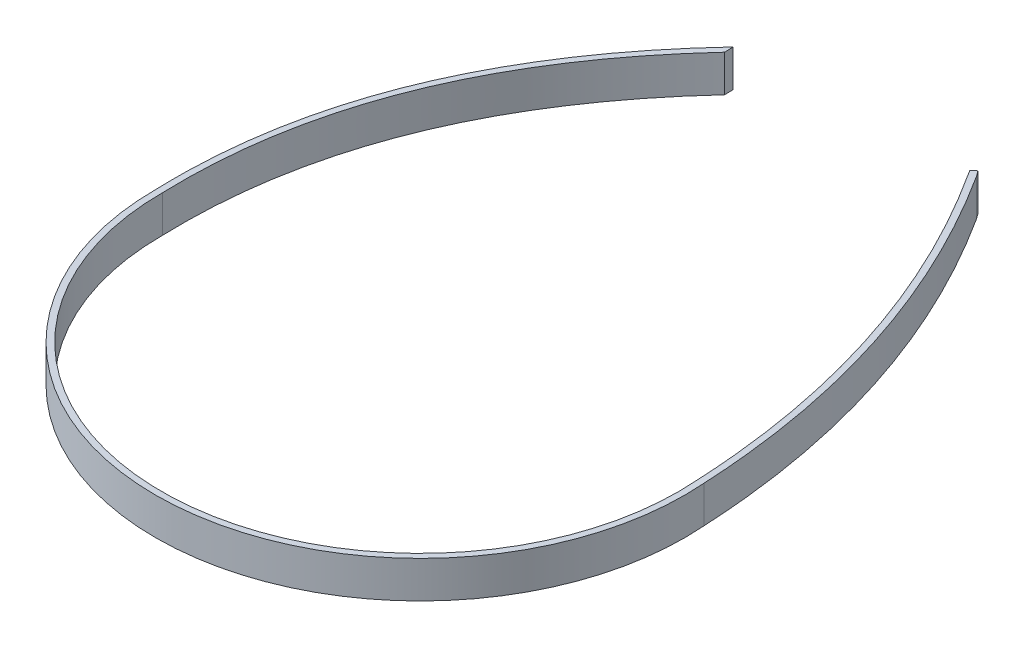
ISO-10303-21;
HEADER;
FILE_DESCRIPTION(('STEP AP214'),'2;1');
FILE_NAME('part.step','',(''),(''),'','','');
FILE_SCHEMA(('AUTOMOTIVE_DESIGN { 1 0 10303 214 1 1 1 1 }'));
ENDSEC;
DATA;
#1=APPLICATION_CONTEXT('core data for automotive mechanical design processes');
#2=APPLICATION_PROTOCOL_DEFINITION('international standard','automotive_design',2000,#1);
#3=PRODUCT_CONTEXT('',#1,'mechanical');
#4=PRODUCT('Part','Part','',(#3));
#5=PRODUCT_RELATED_PRODUCT_CATEGORY('part','',(#4));
#6=PRODUCT_DEFINITION_FORMATION('','',#4);
#7=PRODUCT_DEFINITION_CONTEXT('part definition',#1,'design');
#8=PRODUCT_DEFINITION('design','',#6,#7);
#9=PRODUCT_DEFINITION_SHAPE('','',#8);
#10=(LENGTH_UNIT() NAMED_UNIT(*) SI_UNIT(.MILLI.,.METRE.));
#11=(NAMED_UNIT(*) PLANE_ANGLE_UNIT() SI_UNIT($,.RADIAN.));
#12=(NAMED_UNIT(*) SI_UNIT($,.STERADIAN.) SOLID_ANGLE_UNIT());
#13=UNCERTAINTY_MEASURE_WITH_UNIT(LENGTH_MEASURE(1.E-05),#10,'distance_accuracy_value','');
#14=(GEOMETRIC_REPRESENTATION_CONTEXT(3) GLOBAL_UNCERTAINTY_ASSIGNED_CONTEXT((#13)) GLOBAL_UNIT_ASSIGNED_CONTEXT((#10,
#11,#12)) REPRESENTATION_CONTEXT('',''));
#15=CARTESIAN_POINT('',(0.,0.,0.));
#16=DIRECTION('',(0.,0.,1.));
#17=DIRECTION('',(1.,0.,0.));
#18=AXIS2_PLACEMENT_3D('',#15,#16,#17);
#19=CARTESIAN_POINT('',(-8.07252411648674,1.5,-33.5));
#20=CARTESIAN_POINT('',(-22.1366965566889,1.5,-18.5273338438166));
#21=CARTESIAN_POINT('',(-21.5,1.5,0.));
#22=B_SPLINE_CURVE_WITH_KNOTS('',2,(#19,#20,#21),.UNSPECIFIED.,.F.,.F.,(3,3),(0.,
0.391212050558958),.UNSPECIFIED.);
#23=DIRECTION('',(0.,-1.,0.));
#24=VECTOR('',#23,1.);
#25=SURFACE_OF_LINEAR_EXTRUSION('',#22,#24);
#26=CARTESIAN_POINT('',(-8.07252411648674,-1.5,-33.5));
#27=CARTESIAN_POINT('',(-22.1366965566889,-1.5,-18.5273338438166));
#28=CARTESIAN_POINT('',(-21.5,-1.5,0.));
#29=B_SPLINE_CURVE_WITH_KNOTS('',2,(#26,#27,#28),.UNSPECIFIED.,.F.,.F.,(3,3),(0.,
0.391212050558958),.UNSPECIFIED.);
#30=CARTESIAN_POINT('',(-8.07252411648674,-1.5,-33.5));
#31=VERTEX_POINT('',#30);
#32=CARTESIAN_POINT('',(-21.5,-1.5,0.));
#33=VERTEX_POINT('',#32);
#34=EDGE_CURVE('E203',#31,#33,#29,.T.);
#35=ORIENTED_EDGE('',*,*,#34,.T.);
#36=DIRECTION('',(0.,-1.,0.));
#37=VECTOR('',#36,1.);
#38=CARTESIAN_POINT('',(-21.5,1.5,0.));
#39=LINE('',#38,#37);
#40=CARTESIAN_POINT('',(-21.5,1.5,0.));
#41=VERTEX_POINT('',#40);
#42=EDGE_CURVE('E11',#41,#33,#39,.T.);
#43=ORIENTED_EDGE('',*,*,#42,.F.);
#44=CARTESIAN_POINT('',(-8.07252411648674,1.5,-33.5));
#45=VERTEX_POINT('',#44);
#46=EDGE_CURVE('E241',#45,#41,#22,.T.);
#47=ORIENTED_EDGE('',*,*,#46,.F.);
#48=DIRECTION('',(0.,-1.,0.));
#49=VECTOR('',#48,1.);
#50=CARTESIAN_POINT('',(-8.07252411648674,1.5,-33.5));
#51=LINE('',#50,#49);
#52=EDGE_CURVE('E49',#45,#31,#51,.T.);
#53=ORIENTED_EDGE('',*,*,#52,.T.);
#54=EDGE_LOOP('',(#35,#43,#47,#53));
#55=FACE_BOUND('',#54,.T.);
#56=ADVANCED_FACE('F32',(#55),#25,.F.);
#57=CARTESIAN_POINT('',(0.,1.5,0.));
#58=DIRECTION('',(0.,-1.,0.));
#59=DIRECTION('',(0.,0.,-1.));
#60=AXIS2_PLACEMENT_3D('',#57,#58,#59);
#61=CYLINDRICAL_SURFACE('',#60,21.5);
#62=CARTESIAN_POINT('',(0.,-1.5,0.));
#63=DIRECTION('',(0.,1.,0.));
#64=DIRECTION('',(0.,0.,1.));
#65=AXIS2_PLACEMENT_3D('',#62,#63,#64);
#66=CIRCLE('',#65,21.5);
#67=CARTESIAN_POINT('',(21.4394094780292,-1.5,-1.61298519317216));
#68=VERTEX_POINT('',#67);
#69=EDGE_CURVE('E198',#33,#68,#66,.T.);
#70=ORIENTED_EDGE('',*,*,#69,.T.);
#71=DIRECTION('',(0.,-1.,0.));
#72=VECTOR('',#71,1.);
#73=CARTESIAN_POINT('',(21.4394094780292,1.5,-1.61298519317216));
#74=LINE('',#73,#72);
#75=CARTESIAN_POINT('',(21.4394094780292,1.5,-1.61298519317216));
#76=VERTEX_POINT('',#75);
#77=EDGE_CURVE('E41',#76,#68,#74,.T.);
#78=ORIENTED_EDGE('',*,*,#77,.F.);
#79=CARTESIAN_POINT('',(0.,1.5,0.));
#80=DIRECTION('',(0.,1.,0.));
#81=DIRECTION('',(0.,0.,1.));
#82=AXIS2_PLACEMENT_3D('',#79,#80,#81);
#83=CIRCLE('',#82,21.5);
#84=EDGE_CURVE('E93',#41,#76,#83,.T.);
#85=ORIENTED_EDGE('',*,*,#84,.F.);
#86=ORIENTED_EDGE('',*,*,#42,.T.);
#87=EDGE_LOOP('',(#70,#78,#85,#86));
#88=FACE_BOUND('',#87,.T.);
#89=ADVANCED_FACE('F191',(#88),#61,.T.);
#90=CARTESIAN_POINT('',(10.9274758835133,1.5,-34.2657916261625));
#91=CARTESIAN_POINT('',(20.5757565718411,1.5,-19.203087379411));
#92=CARTESIAN_POINT('',(21.4394094780292,1.5,-1.61298519317215));
#93=B_SPLINE_CURVE_WITH_KNOTS('',2,(#90,#91,#92),.UNSPECIFIED.,.F.,.F.,(3,3),(0.,
0.204404978424151),.UNSPECIFIED.);
#94=DIRECTION('',(0.,-1.,0.));
#95=VECTOR('',#94,1.);
#96=SURFACE_OF_LINEAR_EXTRUSION('',#93,#95);
#97=CARTESIAN_POINT('',(10.9274758835133,-1.5,-34.2657916261625));
#98=CARTESIAN_POINT('',(20.5757565718411,-1.5,-19.203087379411));
#99=CARTESIAN_POINT('',(21.4394094780292,-1.5,-1.61298519317215));
#100=B_SPLINE_CURVE_WITH_KNOTS('',2,(#97,#98,#99),.UNSPECIFIED.,.F.,.F.,(3,3),(0.,
0.204404978424151),.UNSPECIFIED.);
#101=CARTESIAN_POINT('',(10.9274758835133,-1.5,-34.2657916261625));
#102=VERTEX_POINT('',#101);
#103=EDGE_CURVE('E202',#102,#68,#100,.T.);
#104=ORIENTED_EDGE('',*,*,#103,.F.);
#105=DIRECTION('',(0.,-1.,0.));
#106=VECTOR('',#105,1.);
#107=CARTESIAN_POINT('',(10.9274758835133,1.5,-34.2657916261625));
#108=LINE('',#107,#106);
#109=CARTESIAN_POINT('',(10.9274758835133,1.5,-34.2657916261625));
#110=VERTEX_POINT('',#109);
#111=EDGE_CURVE('E254',#110,#102,#108,.T.);
#112=ORIENTED_EDGE('',*,*,#111,.F.);
#113=EDGE_CURVE('E178',#110,#76,#93,.T.);
#114=ORIENTED_EDGE('',*,*,#113,.T.);
#115=ORIENTED_EDGE('',*,*,#77,.T.);
#116=EDGE_LOOP('',(#104,#112,#114,#115));
#117=FACE_BOUND('',#116,.T.);
#118=ADVANCED_FACE('F188',(#117),#96,.T.);
#119=CARTESIAN_POINT('',(10.9274758835133,1.5,-34.2657916261625));
#120=DIRECTION('',(-0.809887603310787,0.,0.586585091869465));
#121=DIRECTION('',(0.586585091869466,0.,0.809887603310787));
#122=AXIS2_PLACEMENT_3D('',#119,#120,#121);
#123=PLANE('',#122);
#124=DIRECTION('',(-0.586585091869466,0.,-0.809887603310787));
#125=VECTOR('',#124,1.);
#126=CARTESIAN_POINT('',(10.9274758835133,-1.5,-34.2657916261625));
#127=LINE('',#126,#125);
#128=CARTESIAN_POINT('',(10.5881527571725,-1.5,-34.7342890314821));
#129=VERTEX_POINT('',#128);
#130=EDGE_CURVE('E209',#102,#129,#127,.T.);
#131=ORIENTED_EDGE('',*,*,#130,.T.);
#132=DIRECTION('',(0.,-1.,0.));
#133=VECTOR('',#132,1.);
#134=CARTESIAN_POINT('',(10.5881527571725,1.5,-34.7342890314821));
#135=LINE('',#134,#133);
#136=CARTESIAN_POINT('',(10.5881527571725,1.5,-34.7342890314821));
#137=VERTEX_POINT('',#136);
#138=EDGE_CURVE('E251',#137,#129,#135,.T.);
#139=ORIENTED_EDGE('',*,*,#138,.F.);
#140=DIRECTION('',(-0.586585091869466,0.,-0.809887603310787));
#141=VECTOR('',#140,1.);
#142=CARTESIAN_POINT('',(10.9274758835133,1.5,-34.2657916261625));
#143=LINE('',#142,#141);
#144=EDGE_CURVE('E176',#110,#137,#143,.T.);
#145=ORIENTED_EDGE('',*,*,#144,.F.);
#146=ORIENTED_EDGE('',*,*,#111,.T.);
#147=EDGE_LOOP('',(#131,#139,#145,#146));
#148=FACE_BOUND('',#147,.T.);
#149=ADVANCED_FACE('F190',(#148),#123,.F.);
#150=CARTESIAN_POINT('',(10.5881527571725,1.5,-34.7342890314821));
#151=DIRECTION('',(0.670009630399926,0.,0.742352406321523));
#152=DIRECTION('',(0.742352406321523,0.,-0.670009630399926));
#153=AXIS2_PLACEMENT_3D('',#150,#151,#152);
#154=PLANE('',#153);
#155=DIRECTION('',(-0.742352406321523,0.,0.670009630399926));
#156=VECTOR('',#155,1.);
#157=CARTESIAN_POINT('',(10.5881527571725,-1.5,-34.7342890314821));
#158=LINE('',#157,#156);
#159=CARTESIAN_POINT('',(10.2367552056466,-1.5,-34.4171354240897));
#160=VERTEX_POINT('',#159);
#161=EDGE_CURVE('E211',#129,#160,#158,.T.);
#162=ORIENTED_EDGE('',*,*,#161,.T.);
#163=DIRECTION('',(0.,-1.,0.));
#164=VECTOR('',#163,1.);
#165=CARTESIAN_POINT('',(10.2367552056466,1.5,-34.4171354240897));
#166=LINE('',#165,#164);
#167=CARTESIAN_POINT('',(10.2367552056466,1.5,-34.4171354240897));
#168=VERTEX_POINT('',#167);
#169=EDGE_CURVE('E248',#168,#160,#166,.T.);
#170=ORIENTED_EDGE('',*,*,#169,.F.);
#171=DIRECTION('',(-0.742352406321523,0.,0.670009630399926));
#172=VECTOR('',#171,1.);
#173=CARTESIAN_POINT('',(10.5881527571725,1.5,-34.7342890314821));
#174=LINE('',#173,#172);
#175=EDGE_CURVE('E171',#137,#168,#174,.T.);
#176=ORIENTED_EDGE('',*,*,#175,.F.);
#177=ORIENTED_EDGE('',*,*,#138,.T.);
#178=EDGE_LOOP('',(#162,#170,#176,#177));
#179=FACE_BOUND('',#178,.T.);
#180=ADVANCED_FACE('F163',(#179),#154,.F.);
#181=CARTESIAN_POINT('',(10.2367552056466,1.5,-34.4171354240897));
#182=CARTESIAN_POINT('',(11.041253846646,1.5,-33.161168118853));
#183=CARTESIAN_POINT('',(12.610265396723,1.5,-30.6001032153678));
#184=CARTESIAN_POINT('',(15.3170609325708,1.5,-25.4028899507587));
#185=CARTESIAN_POINT('',(18.018451365712,1.5,-18.6980397332312));
#186=CARTESIAN_POINT('',(19.7792964176439,1.5,-11.7244936058432));
#187=CARTESIAN_POINT('',(20.6290700446842,1.5,-5.99287621844183));
#188=CARTESIAN_POINT('',(20.8680767862372,1.5,-3.05355770781585));
#189=CARTESIAN_POINT('',(20.9400110636053,1.5,-1.58846533038817));
#190=B_SPLINE_CURVE_WITH_KNOTS('',3,(#181,#182,#183,#184,#185,#186,#187,#188,#189),
.UNSPECIFIED.,.F.,.F.,(4,1,1,1,1,1,4),(-0.00285676078124763,0.0230509566194272,
0.048958674020102,0.100774108821452,0.152589543622801,0.178497261023476,0.204404978424151),.UNSPECIFIED.);
#191=DIRECTION('',(0.,-1.,0.));
#192=VECTOR('',#191,1.);
#193=SURFACE_OF_LINEAR_EXTRUSION('',#190,#192);
#194=CARTESIAN_POINT('',(10.2367552056466,-1.5,-34.4171354240897));
#195=CARTESIAN_POINT('',(11.041253846646,-1.5,-33.161168118853));
#196=CARTESIAN_POINT('',(12.610265396723,-1.5,-30.6001032153678));
#197=CARTESIAN_POINT('',(15.3170609325708,-1.5,-25.4028899507587));
#198=CARTESIAN_POINT('',(18.018451365712,-1.5,-18.6980397332312));
#199=CARTESIAN_POINT('',(19.7792964176439,-1.5,-11.7244936058432));
#200=CARTESIAN_POINT('',(20.6290700446842,-1.5,-5.99287621844183));
#201=CARTESIAN_POINT('',(20.8680767862372,-1.5,-3.05355770781585));
#202=CARTESIAN_POINT('',(20.9400110636053,-1.5,-1.58846533038817));
#203=B_SPLINE_CURVE_WITH_KNOTS('',3,(#194,#195,#196,#197,#198,#199,#200,#201,#202),
.UNSPECIFIED.,.F.,.F.,(4,1,1,1,1,1,4),(-0.00285676078124763,0.0230509566194272,
0.048958674020102,0.100774108821452,0.152589543622801,0.178497261023476,0.204404978424151),.UNSPECIFIED.);
#204=CARTESIAN_POINT('',(20.9400110636053,-1.5,-1.58846533038817));
#205=VERTEX_POINT('',#204);
#206=EDGE_CURVE('E220',#160,#205,#203,.T.);
#207=ORIENTED_EDGE('',*,*,#206,.T.);
#208=DIRECTION('',(0.,-1.,0.));
#209=VECTOR('',#208,1.);
#210=CARTESIAN_POINT('',(20.9400110636053,1.5,-1.58846533038817));
#211=LINE('',#210,#209);
#212=CARTESIAN_POINT('',(20.9400110636053,1.5,-1.58846533038817));
#213=VERTEX_POINT('',#212);
#214=EDGE_CURVE('E245',#213,#205,#211,.T.);
#215=ORIENTED_EDGE('',*,*,#214,.F.);
#216=EDGE_CURVE('E166',#168,#213,#190,.T.);
#217=ORIENTED_EDGE('',*,*,#216,.F.);
#218=ORIENTED_EDGE('',*,*,#169,.T.);
#219=EDGE_LOOP('',(#207,#215,#217,#218));
#220=FACE_BOUND('',#219,.T.);
#221=ADVANCED_FACE('F158',(#220),#193,.F.);
#222=CARTESIAN_POINT('',(20.9400110636053,1.5,-1.58846533038817));
#223=DIRECTION('',(0.99662979110251,0.,0.0820308447290834));
#224=DIRECTION('',(0.0820308447290835,0.,-0.99662979110251));
#225=AXIS2_PLACEMENT_3D('',#222,#223,#224);
#226=PLANE('',#225);
#227=DIRECTION('',(-0.0820308447290835,0.,0.99662979110251));
#228=VECTOR('',#227,1.);
#229=CARTESIAN_POINT('',(20.9400110636053,-1.5,-1.58846533038817));
#230=LINE('',#229,#228);
#231=CARTESIAN_POINT('',(20.9399205212318,-1.5,-1.58736529018856));
#232=VERTEX_POINT('',#231);
#233=EDGE_CURVE('E224',#205,#232,#230,.T.);
#234=ORIENTED_EDGE('',*,*,#233,.T.);
#235=DIRECTION('',(0.,-1.,0.));
#236=VECTOR('',#235,1.);
#237=CARTESIAN_POINT('',(20.9399205212318,1.5,-1.58736529018856));
#238=LINE('',#237,#236);
#239=CARTESIAN_POINT('',(20.9399205212318,1.5,-1.58736529018856));
#240=VERTEX_POINT('',#239);
#241=EDGE_CURVE('E124',#240,#232,#238,.T.);
#242=ORIENTED_EDGE('',*,*,#241,.F.);
#243=DIRECTION('',(-0.0820308447290835,0.,0.99662979110251));
#244=VECTOR('',#243,1.);
#245=CARTESIAN_POINT('',(20.9400110636053,1.5,-1.58846533038817));
#246=LINE('',#245,#244);
#247=EDGE_CURVE('E132',#213,#240,#246,.T.);
#248=ORIENTED_EDGE('',*,*,#247,.F.);
#249=ORIENTED_EDGE('',*,*,#214,.T.);
#250=EDGE_LOOP('',(#234,#242,#248,#249));
#251=FACE_BOUND('',#250,.T.);
#252=ADVANCED_FACE('F155',(#251),#226,.F.);
#253=CARTESIAN_POINT('',(0.,1.5,0.));
#254=DIRECTION('',(0.,-1.,0.));
#255=DIRECTION('',(0.,0.,-1.));
#256=AXIS2_PLACEMENT_3D('',#253,#254,#255);
#257=CYLINDRICAL_SURFACE('',#256,21.);
#258=CARTESIAN_POINT('',(0.,-1.5,0.));
#259=DIRECTION('',(0.,1.,0.));
#260=DIRECTION('',(0.,0.,1.));
#261=AXIS2_PLACEMENT_3D('',#258,#259,#260);
#262=CIRCLE('',#261,21.);
#263=CARTESIAN_POINT('',(-20.9998994310054,-1.5,-0.0649914429757829));
#264=VERTEX_POINT('',#263);
#265=EDGE_CURVE('E120',#264,#232,#262,.T.);
#266=ORIENTED_EDGE('',*,*,#265,.F.);
#267=DIRECTION('',(0.,-1.,0.));
#268=VECTOR('',#267,1.);
#269=CARTESIAN_POINT('',(-20.9998994310054,1.5,-0.0649914429757829));
#270=LINE('',#269,#268);
#271=CARTESIAN_POINT('',(-20.9998994310054,1.5,-0.0649914429757829));
#272=VERTEX_POINT('',#271);
#273=EDGE_CURVE('E115',#272,#264,#270,.T.);
#274=ORIENTED_EDGE('',*,*,#273,.F.);
#275=CARTESIAN_POINT('',(0.,1.5,0.));
#276=DIRECTION('',(0.,1.,0.));
#277=DIRECTION('',(0.,0.,1.));
#278=AXIS2_PLACEMENT_3D('',#275,#276,#277);
#279=CIRCLE('',#278,21.);
#280=EDGE_CURVE('E118',#272,#240,#279,.T.);
#281=ORIENTED_EDGE('',*,*,#280,.T.);
#282=ORIENTED_EDGE('',*,*,#241,.T.);
#283=EDGE_LOOP('',(#266,#274,#281,#282));
#284=FACE_BOUND('',#283,.T.);
#285=ADVANCED_FACE('F117',(#284),#257,.F.);
#286=CARTESIAN_POINT('',(-8.05133290889569,1.5,-32.7871594499156));
#287=CARTESIAN_POINT('',(-8.61034931830942,1.5,-32.1823987535312));
#288=CARTESIAN_POINT('',(-9.71436171541703,1.5,-30.9391962382883));
#289=CARTESIAN_POINT('',(-11.7519510374613,1.5,-28.44151975546));
#290=CARTESIAN_POINT('',(-14.0288878808217,1.5,-25.2442741543055));
#291=CARTESIAN_POINT('',(-16.3116625283301,1.5,-21.3078784145267));
#292=CARTESIAN_POINT('',(-18.1503978919601,1.5,-17.2662499071788));
#293=CARTESIAN_POINT('',(-19.545128940704,1.5,-13.1208765459898));
#294=CARTESIAN_POINT('',(-20.4968070642561,1.5,-8.86508597017263));
#295=CARTESIAN_POINT('',(-21.0044750748146,1.5,-4.53092403834786));
#296=CARTESIAN_POINT('',(-21.0490022290346,1.5,-1.53898689914079));
#297=CARTESIAN_POINT('',(-20.9998994310036,1.5,-0.0649914429757613));
#298=B_SPLINE_CURVE_WITH_KNOTS('',3,(#286,#287,#288,#289,#290,#291,#292,#293,#294,#295,#296,
#297),.UNSPECIFIED.,.F.,.F.,(4,1,1,1,1,1,1,1,1,4),(0.00487226691012667,0.0289596295451278,
0.0531097909460498,0.101410113747894,0.149710436549738,0.198010759351582,0.246311082153426,
0.29461140495527,0.342911727757114,0.390695270376846),.UNSPECIFIED.);
#299=DIRECTION('',(0.,-1.,0.));
#300=VECTOR('',#299,1.);
#301=SURFACE_OF_LINEAR_EXTRUSION('',#298,#300);
#302=CARTESIAN_POINT('',(-8.05133290889569,-1.5,-32.7871594499156));
#303=CARTESIAN_POINT('',(-8.61034931830942,-1.5,-32.1823987535312));
#304=CARTESIAN_POINT('',(-9.71436171541703,-1.5,-30.9391962382883));
#305=CARTESIAN_POINT('',(-11.7519510374613,-1.5,-28.44151975546));
#306=CARTESIAN_POINT('',(-14.0288878808217,-1.5,-25.2442741543055));
#307=CARTESIAN_POINT('',(-16.3116625283301,-1.5,-21.3078784145267));
#308=CARTESIAN_POINT('',(-18.1503978919601,-1.5,-17.2662499071788));
#309=CARTESIAN_POINT('',(-19.545128940704,-1.5,-13.1208765459898));
#310=CARTESIAN_POINT('',(-20.4968070642561,-1.5,-8.86508597017263));
#311=CARTESIAN_POINT('',(-21.0044750748146,-1.5,-4.53092403834786));
#312=CARTESIAN_POINT('',(-21.0490022290346,-1.5,-1.53898689914079));
#313=CARTESIAN_POINT('',(-20.9998994310036,-1.5,-0.0649914429757613));
#314=B_SPLINE_CURVE_WITH_KNOTS('',3,(#302,#303,#304,#305,#306,#307,#308,#309,#310,#311,#312,
#313),.UNSPECIFIED.,.F.,.F.,(4,1,1,1,1,1,1,1,1,4),(0.00487226691012667,0.0289596295451278,
0.0531097909460498,0.101410113747894,0.149710436549738,0.198010759351582,0.246311082153426,
0.29461140495527,0.342911727757114,0.390695270376846),.UNSPECIFIED.);
#315=CARTESIAN_POINT('',(-8.05133290889569,-1.5,-32.7871594499156));
#316=VERTEX_POINT('',#315);
#317=EDGE_CURVE('E231',#316,#264,#314,.T.);
#318=ORIENTED_EDGE('',*,*,#317,.F.);
#319=DIRECTION('',(0.,-1.,0.));
#320=VECTOR('',#319,1.);
#321=CARTESIAN_POINT('',(-8.05133290889569,1.5,-32.7871594499156));
#322=LINE('',#321,#320);
#323=CARTESIAN_POINT('',(-8.05133290889569,1.5,-32.7871594499156));
#324=VERTEX_POINT('',#323);
#325=EDGE_CURVE('E81',#324,#316,#322,.T.);
#326=ORIENTED_EDGE('',*,*,#325,.F.);
#327=EDGE_CURVE('E130',#324,#272,#298,.T.);
#328=ORIENTED_EDGE('',*,*,#327,.T.);
#329=ORIENTED_EDGE('',*,*,#273,.T.);
#330=EDGE_LOOP('',(#318,#326,#328,#329));
#331=FACE_BOUND('',#330,.T.);
#332=ADVANCED_FACE('F135',(#331),#301,.T.);
#333=CARTESIAN_POINT('',(-8.07252411648674,1.5,-33.5));
#334=DIRECTION('',(0.999558420518318,0.,-0.0297147096725728));
#335=DIRECTION('',(-0.0297147096725728,0.,-0.999558420518318));
#336=AXIS2_PLACEMENT_3D('',#333,#334,#335);
#337=PLANE('',#336);
#338=DIRECTION('',(0.0297147096725728,0.,0.999558420518318));
#339=VECTOR('',#338,1.);
#340=CARTESIAN_POINT('',(-8.07252411648674,-1.5,-33.5));
#341=LINE('',#340,#339);
#342=EDGE_CURVE('E235',#31,#316,#341,.T.);
#343=ORIENTED_EDGE('',*,*,#342,.F.);
#344=ORIENTED_EDGE('',*,*,#52,.F.);
#345=DIRECTION('',(0.0297147096725728,0.,0.999558420518318));
#346=VECTOR('',#345,1.);
#347=CARTESIAN_POINT('',(-8.07252411648674,1.5,-33.5));
#348=LINE('',#347,#346);
#349=EDGE_CURVE('E136',#45,#324,#348,.T.);
#350=ORIENTED_EDGE('',*,*,#349,.T.);
#351=ORIENTED_EDGE('',*,*,#325,.T.);
#352=EDGE_LOOP('',(#343,#344,#350,#351));
#353=FACE_BOUND('',#352,.T.);
#354=ADVANCED_FACE('F151',(#353),#337,.T.);
#355=CARTESIAN_POINT('',(-18.4614793074661,1.5,-17.6386669219083));
#356=DIRECTION('',(0.,-1.,0.));
#357=DIRECTION('',(0.,0.,-1.));
#358=AXIS2_PLACEMENT_3D('',#355,#356,#357);
#359=PLANE('',#358);
#360=ORIENTED_EDGE('',*,*,#46,.T.);
#361=ORIENTED_EDGE('',*,*,#84,.T.);
#362=ORIENTED_EDGE('',*,*,#113,.F.);
#363=ORIENTED_EDGE('',*,*,#144,.T.);
#364=ORIENTED_EDGE('',*,*,#175,.T.);
#365=ORIENTED_EDGE('',*,*,#216,.T.);
#366=ORIENTED_EDGE('',*,*,#247,.T.);
#367=ORIENTED_EDGE('',*,*,#280,.F.);
#368=ORIENTED_EDGE('',*,*,#327,.F.);
#369=ORIENTED_EDGE('',*,*,#349,.F.);
#370=EDGE_LOOP('',(#360,#361,#362,#363,#364,#365,#366,#367,#368,#369));
#371=FACE_BOUND('',#370,.T.);
#372=ADVANCED_FACE('F128',(#371),#359,.F.);
#373=CARTESIAN_POINT('',(-18.4614793074661,-1.5,-17.6386669219083));
#374=DIRECTION('',(0.,-1.,0.));
#375=DIRECTION('',(0.,0.,-1.));
#376=AXIS2_PLACEMENT_3D('',#373,#374,#375);
#377=PLANE('',#376);
#378=ORIENTED_EDGE('',*,*,#34,.F.);
#379=ORIENTED_EDGE('',*,*,#342,.T.);
#380=ORIENTED_EDGE('',*,*,#317,.T.);
#381=ORIENTED_EDGE('',*,*,#265,.T.);
#382=ORIENTED_EDGE('',*,*,#233,.F.);
#383=ORIENTED_EDGE('',*,*,#206,.F.);
#384=ORIENTED_EDGE('',*,*,#161,.F.);
#385=ORIENTED_EDGE('',*,*,#130,.F.);
#386=ORIENTED_EDGE('',*,*,#103,.T.);
#387=ORIENTED_EDGE('',*,*,#69,.F.);
#388=EDGE_LOOP('',(#378,#379,#380,#381,#382,#383,#384,#385,#386,#387));
#389=FACE_BOUND('',#388,.T.);
#390=ADVANCED_FACE('F207',(#389),#377,.T.);
#391=CLOSED_SHELL('',(#56,#89,#118,#149,#180,#221,#252,#285,#332,#354,#372,#390));
#392=MANIFOLD_SOLID_BREP('B2',#391);
#393=ADVANCED_BREP_SHAPE_REPRESENTATION('',(#18,#392),#14);
#394=SHAPE_DEFINITION_REPRESENTATION(#9,#393);
ENDSEC;
END-ISO-10303-21;
